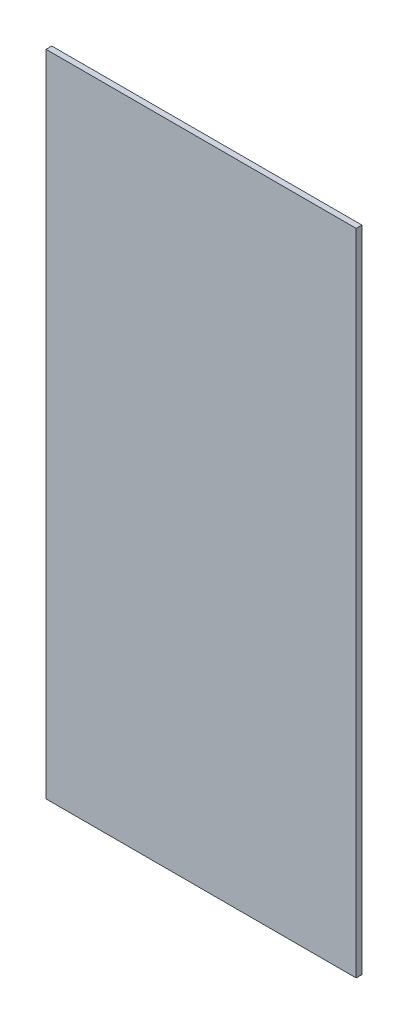
ISO-10303-21;
HEADER;
FILE_DESCRIPTION(('STEP AP214'),'2;1');
FILE_NAME('part.step','',(''),(''),'','','');
FILE_SCHEMA(('AUTOMOTIVE_DESIGN { 1 0 10303 214 1 1 1 1 }'));
ENDSEC;
DATA;
#1=APPLICATION_CONTEXT('core data for automotive mechanical design processes');
#2=APPLICATION_PROTOCOL_DEFINITION('international standard','automotive_design',2000,#1);
#3=PRODUCT_CONTEXT('',#1,'mechanical');
#4=PRODUCT('Part','Part','',(#3));
#5=PRODUCT_RELATED_PRODUCT_CATEGORY('part','',(#4));
#6=PRODUCT_DEFINITION_FORMATION('','',#4);
#7=PRODUCT_DEFINITION_CONTEXT('part definition',#1,'design');
#8=PRODUCT_DEFINITION('design','',#6,#7);
#9=PRODUCT_DEFINITION_SHAPE('','',#8);
#10=(LENGTH_UNIT() NAMED_UNIT(*) SI_UNIT(.MILLI.,.METRE.));
#11=(NAMED_UNIT(*) PLANE_ANGLE_UNIT() SI_UNIT($,.RADIAN.));
#12=(NAMED_UNIT(*) SI_UNIT($,.STERADIAN.) SOLID_ANGLE_UNIT());
#13=UNCERTAINTY_MEASURE_WITH_UNIT(LENGTH_MEASURE(1.E-05),#10,'distance_accuracy_value','');
#14=(GEOMETRIC_REPRESENTATION_CONTEXT(3) GLOBAL_UNCERTAINTY_ASSIGNED_CONTEXT((#13)) GLOBAL_UNIT_ASSIGNED_CONTEXT((#10,
#11,#12)) REPRESENTATION_CONTEXT('',''));
#15=CARTESIAN_POINT('',(0.,0.,0.));
#16=DIRECTION('',(0.,0.,1.));
#17=DIRECTION('',(1.,0.,0.));
#18=AXIS2_PLACEMENT_3D('',#15,#16,#17);
#19=CARTESIAN_POINT('',(-43.,50.,1.6));
#20=DIRECTION('',(0.,-1.,0.));
#21=DIRECTION('',(0.,0.,-1.));
#22=AXIS2_PLACEMENT_3D('',#19,#20,#21);
#23=PLANE('',#22);
#24=DIRECTION('',(-1.,0.,0.));
#25=VECTOR('',#24,1.);
#26=CARTESIAN_POINT('',(-43.,50.,0.));
#27=LINE('',#26,#25);
#28=CARTESIAN_POINT('',(43.,50.,0.));
#29=VERTEX_POINT('',#28);
#30=CARTESIAN_POINT('',(-43.,50.,0.));
#31=VERTEX_POINT('',#30);
#32=EDGE_CURVE('E95',#29,#31,#27,.T.);
#33=ORIENTED_EDGE('',*,*,#32,.T.);
#34=DIRECTION('',(0.,0.,-1.));
#35=VECTOR('',#34,1.);
#36=CARTESIAN_POINT('',(-43.,50.,1.6));
#37=LINE('',#36,#35);
#38=CARTESIAN_POINT('',(-43.,50.,1.6));
#39=VERTEX_POINT('',#38);
#40=EDGE_CURVE('E48',#39,#31,#37,.T.);
#41=ORIENTED_EDGE('',*,*,#40,.F.);
#42=DIRECTION('',(-1.,0.,0.));
#43=VECTOR('',#42,1.);
#44=CARTESIAN_POINT('',(-43.,50.,1.6));
#45=LINE('',#44,#43);
#46=CARTESIAN_POINT('',(43.,50.,1.6));
#47=VERTEX_POINT('',#46);
#48=EDGE_CURVE('E86',#47,#39,#45,.T.);
#49=ORIENTED_EDGE('',*,*,#48,.F.);
#50=DIRECTION('',(0.,0.,-1.));
#51=VECTOR('',#50,1.);
#52=CARTESIAN_POINT('',(43.,50.,1.6));
#53=LINE('',#52,#51);
#54=EDGE_CURVE('E11',#47,#29,#53,.T.);
#55=ORIENTED_EDGE('',*,*,#54,.T.);
#56=EDGE_LOOP('',(#33,#41,#49,#55));
#57=FACE_BOUND('',#56,.T.);
#58=ADVANCED_FACE('F39',(#57),#23,.F.);
#59=CARTESIAN_POINT('',(-43.,-50.,1.6));
#60=DIRECTION('',(1.,0.,0.));
#61=DIRECTION('',(0.,1.,0.));
#62=AXIS2_PLACEMENT_3D('',#59,#60,#61);
#63=PLANE('',#62);
#64=DIRECTION('',(0.,-1.,0.));
#65=VECTOR('',#64,1.);
#66=CARTESIAN_POINT('',(-43.,-50.,0.));
#67=LINE('',#66,#65);
#68=CARTESIAN_POINT('',(-43.,-130.,0.));
#69=VERTEX_POINT('',#68);
#70=EDGE_CURVE('E73',#31,#69,#67,.T.);
#71=ORIENTED_EDGE('',*,*,#70,.T.);
#72=DIRECTION('',(0.,0.,-1.));
#73=VECTOR('',#72,1.);
#74=CARTESIAN_POINT('',(-43.,-130.,1.6));
#75=LINE('',#74,#73);
#76=CARTESIAN_POINT('',(-43.,-130.,1.6));
#77=VERTEX_POINT('',#76);
#78=EDGE_CURVE('E97',#77,#69,#75,.T.);
#79=ORIENTED_EDGE('',*,*,#78,.F.);
#80=DIRECTION('',(0.,-1.,0.));
#81=VECTOR('',#80,1.);
#82=CARTESIAN_POINT('',(-43.,-50.,1.6));
#83=LINE('',#82,#81);
#84=EDGE_CURVE('E90',#39,#77,#83,.T.);
#85=ORIENTED_EDGE('',*,*,#84,.F.);
#86=ORIENTED_EDGE('',*,*,#40,.T.);
#87=EDGE_LOOP('',(#71,#79,#85,#86));
#88=FACE_BOUND('',#87,.T.);
#89=ADVANCED_FACE('F98',(#88),#63,.F.);
#90=CARTESIAN_POINT('',(43.,-130.,1.6));
#91=DIRECTION('',(0.,1.,0.));
#92=DIRECTION('',(0.,0.,1.));
#93=AXIS2_PLACEMENT_3D('',#90,#91,#92);
#94=PLANE('',#93);
#95=DIRECTION('',(1.,0.,0.));
#96=VECTOR('',#95,1.);
#97=CARTESIAN_POINT('',(43.,-130.,0.));
#98=LINE('',#97,#96);
#99=CARTESIAN_POINT('',(43.,-130.,0.));
#100=VERTEX_POINT('',#99);
#101=EDGE_CURVE('E80',#69,#100,#98,.T.);
#102=ORIENTED_EDGE('',*,*,#101,.T.);
#103=DIRECTION('',(0.,0.,-1.));
#104=VECTOR('',#103,1.);
#105=CARTESIAN_POINT('',(43.,-130.,1.6));
#106=LINE('',#105,#104);
#107=CARTESIAN_POINT('',(43.,-130.,1.6));
#108=VERTEX_POINT('',#107);
#109=EDGE_CURVE('E104',#108,#100,#106,.T.);
#110=ORIENTED_EDGE('',*,*,#109,.F.);
#111=DIRECTION('',(1.,0.,0.));
#112=VECTOR('',#111,1.);
#113=CARTESIAN_POINT('',(43.,-130.,1.6));
#114=LINE('',#113,#112);
#115=EDGE_CURVE('E101',#77,#108,#114,.T.);
#116=ORIENTED_EDGE('',*,*,#115,.F.);
#117=ORIENTED_EDGE('',*,*,#78,.T.);
#118=EDGE_LOOP('',(#102,#110,#116,#117));
#119=FACE_BOUND('',#118,.T.);
#120=ADVANCED_FACE('F120',(#119),#94,.F.);
#121=CARTESIAN_POINT('',(43.,-50.,1.6));
#122=DIRECTION('',(-1.,0.,0.));
#123=DIRECTION('',(0.,-1.,0.));
#124=AXIS2_PLACEMENT_3D('',#121,#122,#123);
#125=PLANE('',#124);
#126=DIRECTION('',(0.,1.,0.));
#127=VECTOR('',#126,1.);
#128=CARTESIAN_POINT('',(43.,-50.,0.));
#129=LINE('',#128,#127);
#130=EDGE_CURVE('E114',#100,#29,#129,.T.);
#131=ORIENTED_EDGE('',*,*,#130,.T.);
#132=ORIENTED_EDGE('',*,*,#54,.F.);
#133=DIRECTION('',(0.,1.,0.));
#134=VECTOR('',#133,1.);
#135=CARTESIAN_POINT('',(43.,-50.,1.6));
#136=LINE('',#135,#134);
#137=EDGE_CURVE('E56',#108,#47,#136,.T.);
#138=ORIENTED_EDGE('',*,*,#137,.F.);
#139=ORIENTED_EDGE('',*,*,#109,.T.);
#140=EDGE_LOOP('',(#131,#132,#138,#139));
#141=FACE_BOUND('',#140,.T.);
#142=ADVANCED_FACE('F124',(#141),#125,.F.);
#143=CARTESIAN_POINT('',(0.,0.,1.6));
#144=DIRECTION('',(0.,0.,-1.));
#145=DIRECTION('',(-1.,0.,0.));
#146=AXIS2_PLACEMENT_3D('',#143,#144,#145);
#147=PLANE('',#146);
#148=ORIENTED_EDGE('',*,*,#137,.T.);
#149=ORIENTED_EDGE('',*,*,#48,.T.);
#150=ORIENTED_EDGE('',*,*,#84,.T.);
#151=ORIENTED_EDGE('',*,*,#115,.T.);
#152=EDGE_LOOP('',(#148,#149,#150,#151));
#153=FACE_BOUND('',#152,.T.);
#154=ADVANCED_FACE('F88',(#153),#147,.F.);
#155=CARTESIAN_POINT('',(0.,0.,0.));
#156=DIRECTION('',(0.,0.,-1.));
#157=DIRECTION('',(-1.,0.,0.));
#158=AXIS2_PLACEMENT_3D('',#155,#156,#157);
#159=PLANE('',#158);
#160=ORIENTED_EDGE('',*,*,#32,.F.);
#161=ORIENTED_EDGE('',*,*,#130,.F.);
#162=ORIENTED_EDGE('',*,*,#101,.F.);
#163=ORIENTED_EDGE('',*,*,#70,.F.);
#164=EDGE_LOOP('',(#160,#161,#162,#163));
#165=FACE_BOUND('',#164,.T.);
#166=ADVANCED_FACE('F123',(#165),#159,.T.);
#167=CLOSED_SHELL('',(#58,#89,#120,#142,#154,#166));
#168=MANIFOLD_SOLID_BREP('B2',#167);
#169=ADVANCED_BREP_SHAPE_REPRESENTATION('',(#18,#168),#14);
#170=SHAPE_DEFINITION_REPRESENTATION(#9,#169);
ENDSEC;
END-ISO-10303-21;
